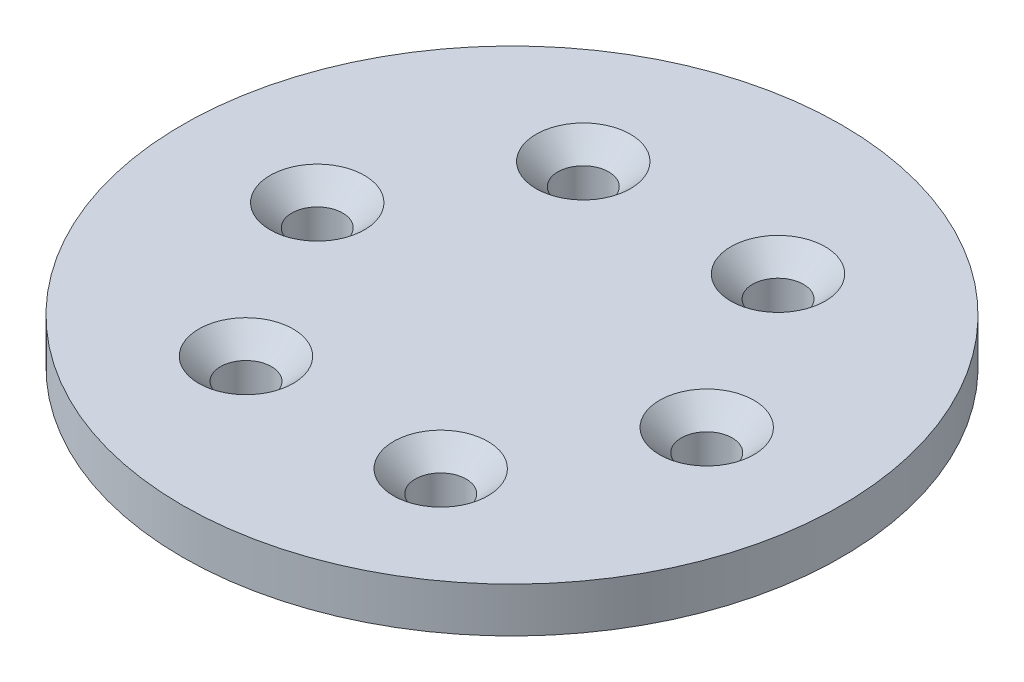
ISO-10303-21;
HEADER;
FILE_DESCRIPTION(('STEP AP214'),'2;1');
FILE_NAME('part.step','',(''),(''),'','','');
FILE_SCHEMA(('AUTOMOTIVE_DESIGN { 1 0 10303 214 1 1 1 1 }'));
ENDSEC;
DATA;
#1=APPLICATION_CONTEXT('core data for automotive mechanical design processes');
#2=APPLICATION_PROTOCOL_DEFINITION('international standard','automotive_design',2000,#1);
#3=PRODUCT_CONTEXT('',#1,'mechanical');
#4=PRODUCT('Part','Part','',(#3));
#5=PRODUCT_RELATED_PRODUCT_CATEGORY('part','',(#4));
#6=PRODUCT_DEFINITION_FORMATION('','',#4);
#7=PRODUCT_DEFINITION_CONTEXT('part definition',#1,'design');
#8=PRODUCT_DEFINITION('design','',#6,#7);
#9=PRODUCT_DEFINITION_SHAPE('','',#8);
#10=(LENGTH_UNIT() NAMED_UNIT(*) SI_UNIT(.MILLI.,.METRE.));
#11=(NAMED_UNIT(*) PLANE_ANGLE_UNIT() SI_UNIT($,.RADIAN.));
#12=(NAMED_UNIT(*) SI_UNIT($,.STERADIAN.) SOLID_ANGLE_UNIT());
#13=UNCERTAINTY_MEASURE_WITH_UNIT(LENGTH_MEASURE(1.E-05),#10,'distance_accuracy_value','');
#14=(GEOMETRIC_REPRESENTATION_CONTEXT(3) GLOBAL_UNCERTAINTY_ASSIGNED_CONTEXT((#13)) GLOBAL_UNIT_ASSIGNED_CONTEXT((#10,
#11,#12)) REPRESENTATION_CONTEXT('',''));
#15=CARTESIAN_POINT('',(0.,0.,0.));
#16=DIRECTION('',(0.,0.,1.));
#17=DIRECTION('',(1.,0.,0.));
#18=AXIS2_PLACEMENT_3D('',#15,#16,#17);
#19=CARTESIAN_POINT('',(0.,0.,0.));
#20=DIRECTION('',(0.,1.,0.));
#21=DIRECTION('',(0.,0.,1.));
#22=AXIS2_PLACEMENT_3D('',#19,#20,#21);
#23=CONICAL_SURFACE('',#22,19.5,1.19028994968253);
#24=CARTESIAN_POINT('',(0.,0.999999999999999,0.));
#25=DIRECTION('',(0.,-1.,0.));
#26=DIRECTION('',(0.,0.,-1.));
#27=AXIS2_PLACEMENT_3D('',#24,#25,#26);
#28=CIRCLE('',#27,22.);
#29=CARTESIAN_POINT('',(0.,0.999999999999999,-22.));
#30=VERTEX_POINT('',#29);
#31=EDGE_CURVE('E45',#30,#30,#28,.T.);
#32=ORIENTED_EDGE('',*,*,#31,.T.);
#33=EDGE_LOOP('',(#32));
#34=FACE_BOUND('',#33,.T.);
#35=CARTESIAN_POINT('',(0.,0.,0.));
#36=DIRECTION('',(0.,-1.,0.));
#37=DIRECTION('',(0.,0.,-1.));
#38=AXIS2_PLACEMENT_3D('',#35,#36,#37);
#39=CIRCLE('',#38,19.5);
#40=CARTESIAN_POINT('',(0.,0.,-19.5));
#41=VERTEX_POINT('',#40);
#42=EDGE_CURVE('E10',#41,#41,#39,.T.);
#43=ORIENTED_EDGE('',*,*,#42,.F.);
#44=EDGE_LOOP('',(#43));
#45=FACE_BOUND('',#44,.T.);
#46=ADVANCED_FACE('F35',(#34,#45),#23,.T.);
#47=CARTESIAN_POINT('',(0.,0.,0.));
#48=DIRECTION('',(0.,-1.,0.));
#49=DIRECTION('',(0.,0.,-1.));
#50=AXIS2_PLACEMENT_3D('',#47,#48,#49);
#51=PLANE('',#50);
#52=CARTESIAN_POINT('',(13.,0.,0.));
#53=DIRECTION('',(0.,1.,0.));
#54=DIRECTION('',(0.,0.,1.));
#55=AXIS2_PLACEMENT_3D('',#52,#53,#54);
#56=CIRCLE('',#55,1.7);
#57=CARTESIAN_POINT('',(13.,0.,1.7));
#58=VERTEX_POINT('',#57);
#59=EDGE_CURVE('E96',#58,#58,#56,.T.);
#60=ORIENTED_EDGE('',*,*,#59,.T.);
#61=EDGE_LOOP('',(#60));
#62=FACE_BOUND('',#61,.T.);
#63=CARTESIAN_POINT('',(6.49999999999997,0.,11.2583302491977));
#64=DIRECTION('',(0.,1.,0.));
#65=DIRECTION('',(0.,0.,1.));
#66=AXIS2_PLACEMENT_3D('',#63,#64,#65);
#67=CIRCLE('',#66,1.7);
#68=CARTESIAN_POINT('',(6.49999999999997,0.,12.9583302491977));
#69=VERTEX_POINT('',#68);
#70=EDGE_CURVE('E87',#69,#69,#67,.T.);
#71=ORIENTED_EDGE('',*,*,#70,.T.);
#72=EDGE_LOOP('',(#71));
#73=FACE_BOUND('',#72,.T.);
#74=CARTESIAN_POINT('',(-6.50000000000005,0.,11.2583302491977));
#75=DIRECTION('',(0.,1.,0.));
#76=DIRECTION('',(0.,0.,1.));
#77=AXIS2_PLACEMENT_3D('',#74,#75,#76);
#78=CIRCLE('',#77,1.7);
#79=CARTESIAN_POINT('',(-6.50000000000005,0.,12.9583302491977));
#80=VERTEX_POINT('',#79);
#81=EDGE_CURVE('E78',#80,#80,#78,.T.);
#82=ORIENTED_EDGE('',*,*,#81,.T.);
#83=EDGE_LOOP('',(#82));
#84=FACE_BOUND('',#83,.T.);
#85=CARTESIAN_POINT('',(-13.,0.,0.));
#86=DIRECTION('',(0.,1.,0.));
#87=DIRECTION('',(0.,0.,1.));
#88=AXIS2_PLACEMENT_3D('',#85,#86,#87);
#89=CIRCLE('',#88,1.7);
#90=CARTESIAN_POINT('',(-13.,0.,1.69999999999991));
#91=VERTEX_POINT('',#90);
#92=EDGE_CURVE('E69',#91,#91,#89,.T.);
#93=ORIENTED_EDGE('',*,*,#92,.T.);
#94=EDGE_LOOP('',(#93));
#95=FACE_BOUND('',#94,.T.);
#96=CARTESIAN_POINT('',(-6.4999999999999,0.,-11.2583302491978));
#97=DIRECTION('',(0.,1.,0.));
#98=DIRECTION('',(0.,0.,1.));
#99=AXIS2_PLACEMENT_3D('',#96,#97,#98);
#100=CIRCLE('',#99,1.7);
#101=CARTESIAN_POINT('',(-6.4999999999999,0.,-9.55833024919776));
#102=VERTEX_POINT('',#101);
#103=EDGE_CURVE('E60',#102,#102,#100,.T.);
#104=ORIENTED_EDGE('',*,*,#103,.T.);
#105=EDGE_LOOP('',(#104));
#106=FACE_BOUND('',#105,.T.);
#107=CARTESIAN_POINT('',(6.50000000000013,0.,-11.2583302491976));
#108=DIRECTION('',(0.,1.,0.));
#109=DIRECTION('',(0.,0.,1.));
#110=AXIS2_PLACEMENT_3D('',#107,#108,#109);
#111=CIRCLE('',#110,1.7);
#112=CARTESIAN_POINT('',(6.50000000000013,0.,-9.55833024919763));
#113=VERTEX_POINT('',#112);
#114=EDGE_CURVE('E49',#113,#113,#111,.T.);
#115=ORIENTED_EDGE('',*,*,#114,.T.);
#116=EDGE_LOOP('',(#115));
#117=FACE_BOUND('',#116,.T.);
#118=ORIENTED_EDGE('',*,*,#42,.T.);
#119=EDGE_LOOP('',(#118));
#120=FACE_BOUND('',#119,.T.);
#121=ADVANCED_FACE('F112',(#62,#73,#84,#95,#106,#117,#120),#51,.T.);
#122=CARTESIAN_POINT('',(0.,4.,0.));
#123=DIRECTION('',(0.,1.,0.));
#124=DIRECTION('',(0.,0.,1.));
#125=AXIS2_PLACEMENT_3D('',#122,#123,#124);
#126=PLANE('',#125);
#127=CARTESIAN_POINT('',(13.,4.,0.));
#128=DIRECTION('',(0.,1.,0.));
#129=DIRECTION('',(0.,0.,1.));
#130=AXIS2_PLACEMENT_3D('',#127,#128,#129);
#131=CIRCLE('',#130,3.15);
#132=CARTESIAN_POINT('',(13.,4.,3.15));
#133=VERTEX_POINT('',#132);
#134=EDGE_CURVE('E102',#133,#133,#131,.T.);
#135=ORIENTED_EDGE('',*,*,#134,.F.);
#136=EDGE_LOOP('',(#135));
#137=FACE_BOUND('',#136,.T.);
#138=CARTESIAN_POINT('',(6.49999999999997,4.,11.2583302491977));
#139=DIRECTION('',(0.,1.,0.));
#140=DIRECTION('',(0.,0.,1.));
#141=AXIS2_PLACEMENT_3D('',#138,#139,#140);
#142=CIRCLE('',#141,3.15);
#143=CARTESIAN_POINT('',(6.49999999999997,4.,14.4083302491977));
#144=VERTEX_POINT('',#143);
#145=EDGE_CURVE('E93',#144,#144,#142,.T.);
#146=ORIENTED_EDGE('',*,*,#145,.F.);
#147=EDGE_LOOP('',(#146));
#148=FACE_BOUND('',#147,.T.);
#149=CARTESIAN_POINT('',(-6.50000000000005,4.,11.2583302491977));
#150=DIRECTION('',(0.,1.,0.));
#151=DIRECTION('',(0.,0.,1.));
#152=AXIS2_PLACEMENT_3D('',#149,#150,#151);
#153=CIRCLE('',#152,3.15);
#154=CARTESIAN_POINT('',(-6.50000000000005,4.,14.4083302491977));
#155=VERTEX_POINT('',#154);
#156=EDGE_CURVE('E84',#155,#155,#153,.T.);
#157=ORIENTED_EDGE('',*,*,#156,.F.);
#158=EDGE_LOOP('',(#157));
#159=FACE_BOUND('',#158,.T.);
#160=CARTESIAN_POINT('',(-13.,4.,0.));
#161=DIRECTION('',(0.,1.,0.));
#162=DIRECTION('',(0.,0.,1.));
#163=AXIS2_PLACEMENT_3D('',#160,#161,#162);
#164=CIRCLE('',#163,3.15);
#165=CARTESIAN_POINT('',(-13.,4.,3.14999999999991));
#166=VERTEX_POINT('',#165);
#167=EDGE_CURVE('E75',#166,#166,#164,.T.);
#168=ORIENTED_EDGE('',*,*,#167,.F.);
#169=EDGE_LOOP('',(#168));
#170=FACE_BOUND('',#169,.T.);
#171=CARTESIAN_POINT('',(-6.4999999999999,4.,-11.2583302491978));
#172=DIRECTION('',(0.,1.,0.));
#173=DIRECTION('',(0.,0.,1.));
#174=AXIS2_PLACEMENT_3D('',#171,#172,#173);
#175=CIRCLE('',#174,3.15);
#176=CARTESIAN_POINT('',(-6.4999999999999,4.,-8.10833024919776));
#177=VERTEX_POINT('',#176);
#178=EDGE_CURVE('E66',#177,#177,#175,.T.);
#179=ORIENTED_EDGE('',*,*,#178,.F.);
#180=EDGE_LOOP('',(#179));
#181=FACE_BOUND('',#180,.T.);
#182=CARTESIAN_POINT('',(6.50000000000013,4.,-11.2583302491976));
#183=DIRECTION('',(0.,1.,0.));
#184=DIRECTION('',(0.,0.,1.));
#185=AXIS2_PLACEMENT_3D('',#182,#183,#184);
#186=CIRCLE('',#185,3.15);
#187=CARTESIAN_POINT('',(6.50000000000013,4.,-8.10833024919763));
#188=VERTEX_POINT('',#187);
#189=EDGE_CURVE('E57',#188,#188,#186,.T.);
#190=ORIENTED_EDGE('',*,*,#189,.F.);
#191=EDGE_LOOP('',(#190));
#192=FACE_BOUND('',#191,.T.);
#193=CARTESIAN_POINT('',(0.,4.,0.));
#194=DIRECTION('',(0.,-1.,0.));
#195=DIRECTION('',(0.,0.,-1.));
#196=AXIS2_PLACEMENT_3D('',#193,#194,#195);
#197=CIRCLE('',#196,22.);
#198=CARTESIAN_POINT('',(0.,4.,-22.));
#199=VERTEX_POINT('',#198);
#200=EDGE_CURVE('E41',#199,#199,#197,.T.);
#201=ORIENTED_EDGE('',*,*,#200,.F.);
#202=EDGE_LOOP('',(#201));
#203=FACE_BOUND('',#202,.T.);
#204=ADVANCED_FACE('F108',(#137,#148,#159,#170,#181,#192,#203),#126,.T.);
#205=CARTESIAN_POINT('',(0.,0.,0.));
#206=DIRECTION('',(0.,-1.,0.));
#207=DIRECTION('',(0.,0.,-1.));
#208=AXIS2_PLACEMENT_3D('',#205,#206,#207);
#209=CYLINDRICAL_SURFACE('',#208,22.);
#210=ORIENTED_EDGE('',*,*,#200,.T.);
#211=EDGE_LOOP('',(#210));
#212=FACE_BOUND('',#211,.T.);
#213=ORIENTED_EDGE('',*,*,#31,.F.);
#214=EDGE_LOOP('',(#213));
#215=FACE_BOUND('',#214,.T.);
#216=ADVANCED_FACE('F111',(#212,#215),#209,.T.);
#217=CARTESIAN_POINT('',(6.50000000000013,4.,-11.2583302491976));
#218=DIRECTION('',(0.,1.,0.));
#219=DIRECTION('',(0.,0.,1.));
#220=AXIS2_PLACEMENT_3D('',#217,#218,#219);
#221=CYLINDRICAL_SURFACE('',#220,1.7);
#222=ORIENTED_EDGE('',*,*,#114,.F.);
#223=EDGE_LOOP('',(#222));
#224=FACE_BOUND('',#223,.T.);
#225=CARTESIAN_POINT('',(6.50000000000013,2.55,-11.2583302491976));
#226=DIRECTION('',(0.,1.,0.));
#227=DIRECTION('',(0.,0.,1.));
#228=AXIS2_PLACEMENT_3D('',#225,#226,#227);
#229=CIRCLE('',#228,1.7);
#230=CARTESIAN_POINT('',(6.50000000000013,2.55,-9.55833024919763));
#231=VERTEX_POINT('',#230);
#232=EDGE_CURVE('E54',#231,#231,#229,.T.);
#233=ORIENTED_EDGE('',*,*,#232,.T.);
#234=EDGE_LOOP('',(#233));
#235=FACE_BOUND('',#234,.T.);
#236=ADVANCED_FACE('F128',(#224,#235),#221,.F.);
#237=CARTESIAN_POINT('',(6.50000000000013,4.,-11.2583302491976));
#238=DIRECTION('',(0.,1.,0.));
#239=DIRECTION('',(0.,0.,1.));
#240=AXIS2_PLACEMENT_3D('',#237,#238,#239);
#241=CONICAL_SURFACE('',#240,3.15,0.785398163397448);
#242=ORIENTED_EDGE('',*,*,#232,.F.);
#243=EDGE_LOOP('',(#242));
#244=FACE_BOUND('',#243,.T.);
#245=ORIENTED_EDGE('',*,*,#189,.T.);
#246=EDGE_LOOP('',(#245));
#247=FACE_BOUND('',#246,.T.);
#248=ADVANCED_FACE('F125',(#244,#247),#241,.F.);
#249=CARTESIAN_POINT('',(-6.4999999999999,4.,-11.2583302491978));
#250=DIRECTION('',(0.,1.,0.));
#251=DIRECTION('',(0.,0.,1.));
#252=AXIS2_PLACEMENT_3D('',#249,#250,#251);
#253=CYLINDRICAL_SURFACE('',#252,1.7);
#254=ORIENTED_EDGE('',*,*,#103,.F.);
#255=EDGE_LOOP('',(#254));
#256=FACE_BOUND('',#255,.T.);
#257=CARTESIAN_POINT('',(-6.4999999999999,2.55,-11.2583302491978));
#258=DIRECTION('',(0.,1.,0.));
#259=DIRECTION('',(0.,0.,1.));
#260=AXIS2_PLACEMENT_3D('',#257,#258,#259);
#261=CIRCLE('',#260,1.7);
#262=CARTESIAN_POINT('',(-6.4999999999999,2.55,-9.55833024919776));
#263=VERTEX_POINT('',#262);
#264=EDGE_CURVE('E63',#263,#263,#261,.T.);
#265=ORIENTED_EDGE('',*,*,#264,.T.);
#266=EDGE_LOOP('',(#265));
#267=FACE_BOUND('',#266,.T.);
#268=ADVANCED_FACE('F127',(#256,#267),#253,.F.);
#269=CARTESIAN_POINT('',(-6.4999999999999,4.,-11.2583302491978));
#270=DIRECTION('',(0.,1.,0.));
#271=DIRECTION('',(0.,0.,1.));
#272=AXIS2_PLACEMENT_3D('',#269,#270,#271);
#273=CONICAL_SURFACE('',#272,3.15,0.785398163397448);
#274=ORIENTED_EDGE('',*,*,#264,.F.);
#275=EDGE_LOOP('',(#274));
#276=FACE_BOUND('',#275,.T.);
#277=ORIENTED_EDGE('',*,*,#178,.T.);
#278=EDGE_LOOP('',(#277));
#279=FACE_BOUND('',#278,.T.);
#280=ADVANCED_FACE('F135',(#276,#279),#273,.F.);
#281=CARTESIAN_POINT('',(-13.,4.,0.));
#282=DIRECTION('',(0.,1.,0.));
#283=DIRECTION('',(0.,0.,1.));
#284=AXIS2_PLACEMENT_3D('',#281,#282,#283);
#285=CYLINDRICAL_SURFACE('',#284,1.7);
#286=ORIENTED_EDGE('',*,*,#92,.F.);
#287=EDGE_LOOP('',(#286));
#288=FACE_BOUND('',#287,.T.);
#289=CARTESIAN_POINT('',(-13.,2.55,0.));
#290=DIRECTION('',(0.,1.,0.));
#291=DIRECTION('',(0.,0.,1.));
#292=AXIS2_PLACEMENT_3D('',#289,#290,#291);
#293=CIRCLE('',#292,1.7);
#294=CARTESIAN_POINT('',(-13.,2.55,1.69999999999991));
#295=VERTEX_POINT('',#294);
#296=EDGE_CURVE('E72',#295,#295,#293,.T.);
#297=ORIENTED_EDGE('',*,*,#296,.T.);
#298=EDGE_LOOP('',(#297));
#299=FACE_BOUND('',#298,.T.);
#300=ADVANCED_FACE('F182',(#288,#299),#285,.F.);
#301=CARTESIAN_POINT('',(-13.,4.,0.));
#302=DIRECTION('',(0.,1.,0.));
#303=DIRECTION('',(0.,0.,1.));
#304=AXIS2_PLACEMENT_3D('',#301,#302,#303);
#305=CONICAL_SURFACE('',#304,3.15,0.785398163397448);
#306=ORIENTED_EDGE('',*,*,#296,.F.);
#307=EDGE_LOOP('',(#306));
#308=FACE_BOUND('',#307,.T.);
#309=ORIENTED_EDGE('',*,*,#167,.T.);
#310=EDGE_LOOP('',(#309));
#311=FACE_BOUND('',#310,.T.);
#312=ADVANCED_FACE('F192',(#308,#311),#305,.F.);
#313=CARTESIAN_POINT('',(-6.50000000000005,4.,11.2583302491977));
#314=DIRECTION('',(0.,1.,0.));
#315=DIRECTION('',(0.,0.,1.));
#316=AXIS2_PLACEMENT_3D('',#313,#314,#315);
#317=CYLINDRICAL_SURFACE('',#316,1.7);
#318=ORIENTED_EDGE('',*,*,#81,.F.);
#319=EDGE_LOOP('',(#318));
#320=FACE_BOUND('',#319,.T.);
#321=CARTESIAN_POINT('',(-6.50000000000005,2.55,11.2583302491977));
#322=DIRECTION('',(0.,1.,0.));
#323=DIRECTION('',(0.,0.,1.));
#324=AXIS2_PLACEMENT_3D('',#321,#322,#323);
#325=CIRCLE('',#324,1.7);
#326=CARTESIAN_POINT('',(-6.50000000000005,2.55,12.9583302491977));
#327=VERTEX_POINT('',#326);
#328=EDGE_CURVE('E81',#327,#327,#325,.T.);
#329=ORIENTED_EDGE('',*,*,#328,.T.);
#330=EDGE_LOOP('',(#329));
#331=FACE_BOUND('',#330,.T.);
#332=ADVANCED_FACE('F202',(#320,#331),#317,.F.);
#333=CARTESIAN_POINT('',(-6.50000000000005,4.,11.2583302491977));
#334=DIRECTION('',(0.,1.,0.));
#335=DIRECTION('',(0.,0.,1.));
#336=AXIS2_PLACEMENT_3D('',#333,#334,#335);
#337=CONICAL_SURFACE('',#336,3.15,0.785398163397448);
#338=ORIENTED_EDGE('',*,*,#328,.F.);
#339=EDGE_LOOP('',(#338));
#340=FACE_BOUND('',#339,.T.);
#341=ORIENTED_EDGE('',*,*,#156,.T.);
#342=EDGE_LOOP('',(#341));
#343=FACE_BOUND('',#342,.T.);
#344=ADVANCED_FACE('F212',(#340,#343),#337,.F.);
#345=CARTESIAN_POINT('',(6.49999999999997,4.,11.2583302491977));
#346=DIRECTION('',(0.,1.,0.));
#347=DIRECTION('',(0.,0.,1.));
#348=AXIS2_PLACEMENT_3D('',#345,#346,#347);
#349=CYLINDRICAL_SURFACE('',#348,1.7);
#350=ORIENTED_EDGE('',*,*,#70,.F.);
#351=EDGE_LOOP('',(#350));
#352=FACE_BOUND('',#351,.T.);
#353=CARTESIAN_POINT('',(6.49999999999997,2.55,11.2583302491977));
#354=DIRECTION('',(0.,1.,0.));
#355=DIRECTION('',(0.,0.,1.));
#356=AXIS2_PLACEMENT_3D('',#353,#354,#355);
#357=CIRCLE('',#356,1.7);
#358=CARTESIAN_POINT('',(6.49999999999997,2.55,12.9583302491977));
#359=VERTEX_POINT('',#358);
#360=EDGE_CURVE('E90',#359,#359,#357,.T.);
#361=ORIENTED_EDGE('',*,*,#360,.T.);
#362=EDGE_LOOP('',(#361));
#363=FACE_BOUND('',#362,.T.);
#364=ADVANCED_FACE('F222',(#352,#363),#349,.F.);
#365=CARTESIAN_POINT('',(6.49999999999997,4.,11.2583302491977));
#366=DIRECTION('',(0.,1.,0.));
#367=DIRECTION('',(0.,0.,1.));
#368=AXIS2_PLACEMENT_3D('',#365,#366,#367);
#369=CONICAL_SURFACE('',#368,3.15,0.785398163397448);
#370=ORIENTED_EDGE('',*,*,#360,.F.);
#371=EDGE_LOOP('',(#370));
#372=FACE_BOUND('',#371,.T.);
#373=ORIENTED_EDGE('',*,*,#145,.T.);
#374=EDGE_LOOP('',(#373));
#375=FACE_BOUND('',#374,.T.);
#376=ADVANCED_FACE('F232',(#372,#375),#369,.F.);
#377=CARTESIAN_POINT('',(13.,4.,0.));
#378=DIRECTION('',(0.,1.,0.));
#379=DIRECTION('',(0.,0.,1.));
#380=AXIS2_PLACEMENT_3D('',#377,#378,#379);
#381=CYLINDRICAL_SURFACE('',#380,1.7);
#382=ORIENTED_EDGE('',*,*,#59,.F.);
#383=EDGE_LOOP('',(#382));
#384=FACE_BOUND('',#383,.T.);
#385=CARTESIAN_POINT('',(13.,2.55,0.));
#386=DIRECTION('',(0.,1.,0.));
#387=DIRECTION('',(0.,0.,1.));
#388=AXIS2_PLACEMENT_3D('',#385,#386,#387);
#389=CIRCLE('',#388,1.7);
#390=CARTESIAN_POINT('',(13.,2.55,1.7));
#391=VERTEX_POINT('',#390);
#392=EDGE_CURVE('E99',#391,#391,#389,.T.);
#393=ORIENTED_EDGE('',*,*,#392,.T.);
#394=EDGE_LOOP('',(#393));
#395=FACE_BOUND('',#394,.T.);
#396=ADVANCED_FACE('F242',(#384,#395),#381,.F.);
#397=CARTESIAN_POINT('',(13.,4.,0.));
#398=DIRECTION('',(0.,1.,0.));
#399=DIRECTION('',(0.,0.,1.));
#400=AXIS2_PLACEMENT_3D('',#397,#398,#399);
#401=CONICAL_SURFACE('',#400,3.15,0.785398163397447);
#402=ORIENTED_EDGE('',*,*,#392,.F.);
#403=EDGE_LOOP('',(#402));
#404=FACE_BOUND('',#403,.T.);
#405=ORIENTED_EDGE('',*,*,#134,.T.);
#406=EDGE_LOOP('',(#405));
#407=FACE_BOUND('',#406,.T.);
#408=ADVANCED_FACE('F106',(#404,#407),#401,.F.);
#409=CLOSED_SHELL('',(#46,#121,#204,#216,#236,#248,#268,#280,#300,#312,#332,#344,#364,#376,#396,#408));
#410=MANIFOLD_SOLID_BREP('B2',#409);
#411=ADVANCED_BREP_SHAPE_REPRESENTATION('',(#18,#410),#14);
#412=SHAPE_DEFINITION_REPRESENTATION(#9,#411);
ENDSEC;
END-ISO-10303-21;
